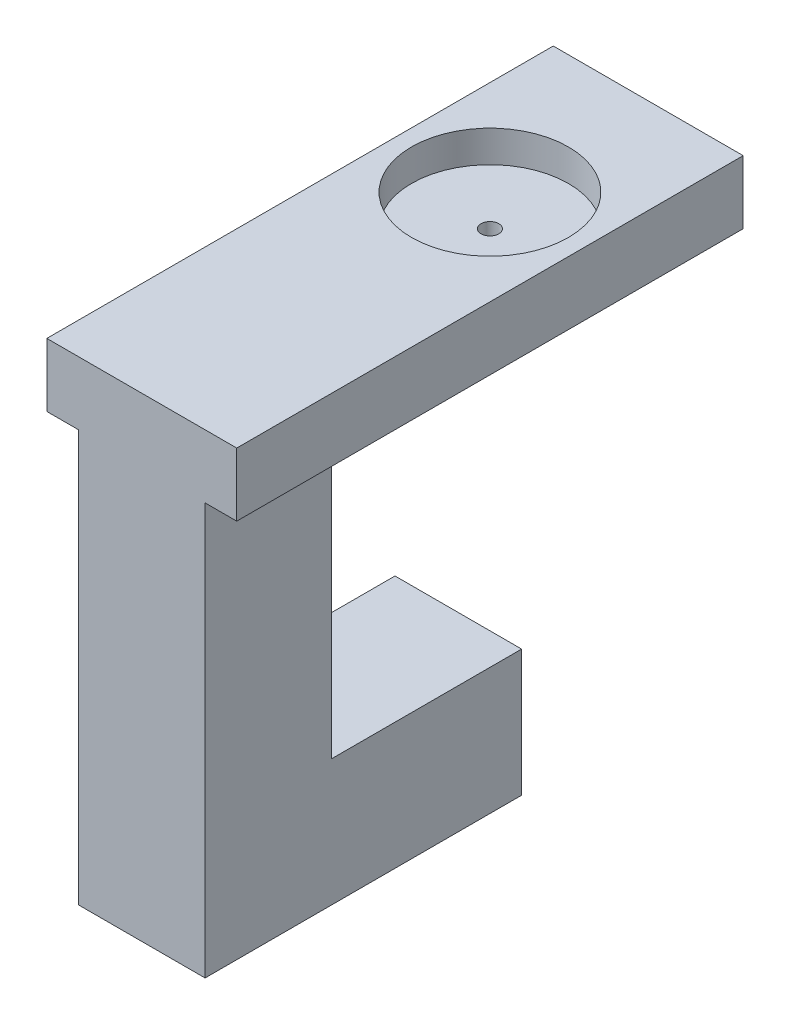
ISO-10303-21;
HEADER;
FILE_DESCRIPTION(('STEP AP214'),'2;1');
FILE_NAME('part.step','',(''),(''),'','','');
FILE_SCHEMA(('AUTOMOTIVE_DESIGN { 1 0 10303 214 1 1 1 1 }'));
ENDSEC;
DATA;
#1=APPLICATION_CONTEXT('core data for automotive mechanical design processes');
#2=APPLICATION_PROTOCOL_DEFINITION('international standard','automotive_design',2000,#1);
#3=PRODUCT_CONTEXT('',#1,'mechanical');
#4=PRODUCT('Part','Part','',(#3));
#5=PRODUCT_RELATED_PRODUCT_CATEGORY('part','',(#4));
#6=PRODUCT_DEFINITION_FORMATION('','',#4);
#7=PRODUCT_DEFINITION_CONTEXT('part definition',#1,'design');
#8=PRODUCT_DEFINITION('design','',#6,#7);
#9=PRODUCT_DEFINITION_SHAPE('','',#8);
#10=(LENGTH_UNIT() NAMED_UNIT(*) SI_UNIT(.MILLI.,.METRE.));
#11=(NAMED_UNIT(*) PLANE_ANGLE_UNIT() SI_UNIT($,.RADIAN.));
#12=(NAMED_UNIT(*) SI_UNIT($,.STERADIAN.) SOLID_ANGLE_UNIT());
#13=UNCERTAINTY_MEASURE_WITH_UNIT(LENGTH_MEASURE(1.E-05),#10,'distance_accuracy_value','');
#14=(GEOMETRIC_REPRESENTATION_CONTEXT(3) GLOBAL_UNCERTAINTY_ASSIGNED_CONTEXT((#13)) GLOBAL_UNIT_ASSIGNED_CONTEXT((#10,
#11,#12)) REPRESENTATION_CONTEXT('',''));
#15=CARTESIAN_POINT('',(0.,0.,0.));
#16=DIRECTION('',(0.,0.,1.));
#17=DIRECTION('',(1.,0.,0.));
#18=AXIS2_PLACEMENT_3D('',#15,#16,#17);
#19=CARTESIAN_POINT('',(0.,5.,-4.99999999999999));
#20=DIRECTION('',(0.,1.,0.));
#21=DIRECTION('',(0.,0.,1.));
#22=AXIS2_PLACEMENT_3D('',#19,#20,#21);
#23=CYLINDRICAL_SURFACE('',#22,1.4);
#24=CARTESIAN_POINT('',(0.,55.,-4.99999999999999));
#25=DIRECTION('',(0.,-1.,0.));
#26=DIRECTION('',(0.,0.,-1.));
#27=AXIS2_PLACEMENT_3D('',#24,#25,#26);
#28=CIRCLE('',#27,1.4);
#29=CARTESIAN_POINT('',(0.,55.,-6.39999999999999));
#30=VERTEX_POINT('',#29);
#31=EDGE_CURVE('E154',#30,#30,#28,.T.);
#32=ORIENTED_EDGE('',*,*,#31,.T.);
#33=EDGE_LOOP('',(#32));
#34=FACE_BOUND('',#33,.T.);
#35=CARTESIAN_POINT('',(0.,60.,-4.99999999999999));
#36=DIRECTION('',(0.,1.,0.));
#37=DIRECTION('',(0.,0.,1.));
#38=AXIS2_PLACEMENT_3D('',#35,#36,#37);
#39=CIRCLE('',#38,1.4);
#40=CARTESIAN_POINT('',(0.,60.,-3.59999999999999));
#41=VERTEX_POINT('',#40);
#42=EDGE_CURVE('E49',#41,#41,#39,.F.);
#43=ORIENTED_EDGE('',*,*,#42,.F.);
#44=EDGE_LOOP('',(#43));
#45=FACE_BOUND('',#44,.T.);
#46=ADVANCED_FACE('F45',(#34,#45),#23,.F.);
#47=CARTESIAN_POINT('',(-10.,10.,50.));
#48=DIRECTION('',(0.,-1.,0.));
#49=DIRECTION('',(0.,0.,-1.));
#50=AXIS2_PLACEMENT_3D('',#47,#48,#49);
#51=PLANE('',#50);
#52=DIRECTION('',(-1.,0.,0.));
#53=VECTOR('',#52,1.);
#54=CARTESIAN_POINT('',(-10.,10.,30.));
#55=LINE('',#54,#53);
#56=CARTESIAN_POINT('',(10.,10.,30.));
#57=VERTEX_POINT('',#56);
#58=CARTESIAN_POINT('',(-10.,10.,30.));
#59=VERTEX_POINT('',#58);
#60=EDGE_CURVE('E191',#57,#59,#55,.T.);
#61=ORIENTED_EDGE('',*,*,#60,.F.);
#62=DIRECTION('',(0.,0.,-1.));
#63=VECTOR('',#62,1.);
#64=CARTESIAN_POINT('',(10.,10.,50.));
#65=LINE('',#64,#63);
#66=CARTESIAN_POINT('',(10.,10.,0.));
#67=VERTEX_POINT('',#66);
#68=EDGE_CURVE('E55',#57,#67,#65,.T.);
#69=ORIENTED_EDGE('',*,*,#68,.T.);
#70=DIRECTION('',(-1.,0.,0.));
#71=VECTOR('',#70,1.);
#72=CARTESIAN_POINT('',(-10.,10.,0.));
#73=LINE('',#72,#71);
#74=CARTESIAN_POINT('',(-10.,10.,0.));
#75=VERTEX_POINT('',#74);
#76=EDGE_CURVE('E215',#67,#75,#73,.T.);
#77=ORIENTED_EDGE('',*,*,#76,.T.);
#78=DIRECTION('',(0.,0.,-1.));
#79=VECTOR('',#78,1.);
#80=CARTESIAN_POINT('',(-10.,10.,50.));
#81=LINE('',#80,#79);
#82=EDGE_CURVE('E231',#59,#75,#81,.T.);
#83=ORIENTED_EDGE('',*,*,#82,.F.);
#84=EDGE_LOOP('',(#61,#69,#77,#83));
#85=FACE_BOUND('',#84,.T.);
#86=ADVANCED_FACE('F239',(#85),#51,.F.);
#87=CARTESIAN_POINT('',(10.,10.,50.));
#88=DIRECTION('',(-1.,0.,0.));
#89=DIRECTION('',(0.,-1.,0.));
#90=AXIS2_PLACEMENT_3D('',#87,#88,#89);
#91=PLANE('',#90);
#92=DIRECTION('',(0.,-1.,0.));
#93=VECTOR('',#92,1.);
#94=CARTESIAN_POINT('',(10.,61.,30.));
#95=LINE('',#94,#93);
#96=CARTESIAN_POINT('',(10.,55.,30.));
#97=VERTEX_POINT('',#96);
#98=EDGE_CURVE('E198',#97,#57,#95,.T.);
#99=ORIENTED_EDGE('',*,*,#98,.F.);
#100=DIRECTION('',(0.,0.,1.));
#101=VECTOR('',#100,1.);
#102=CARTESIAN_POINT('',(9.99999999999999,55.,50.));
#103=LINE('',#102,#101);
#104=CARTESIAN_POINT('',(9.99999999999999,55.,50.));
#105=VERTEX_POINT('',#104);
#106=EDGE_CURVE('E70',#97,#105,#103,.T.);
#107=ORIENTED_EDGE('',*,*,#106,.T.);
#108=DIRECTION('',(0.,1.,0.));
#109=VECTOR('',#108,1.);
#110=CARTESIAN_POINT('',(10.,10.,50.));
#111=LINE('',#110,#109);
#112=CARTESIAN_POINT('',(10.,-10.,50.));
#113=VERTEX_POINT('',#112);
#114=EDGE_CURVE('E202',#113,#105,#111,.T.);
#115=ORIENTED_EDGE('',*,*,#114,.F.);
#116=DIRECTION('',(0.,0.,-1.));
#117=VECTOR('',#116,1.);
#118=CARTESIAN_POINT('',(10.,-10.,50.));
#119=LINE('',#118,#117);
#120=CARTESIAN_POINT('',(10.,-10.,0.));
#121=VERTEX_POINT('',#120);
#122=EDGE_CURVE('E211',#113,#121,#119,.T.);
#123=ORIENTED_EDGE('',*,*,#122,.T.);
#124=DIRECTION('',(0.,1.,0.));
#125=VECTOR('',#124,1.);
#126=CARTESIAN_POINT('',(10.,10.,0.));
#127=LINE('',#126,#125);
#128=EDGE_CURVE('E201',#121,#67,#127,.T.);
#129=ORIENTED_EDGE('',*,*,#128,.T.);
#130=ORIENTED_EDGE('',*,*,#68,.F.);
#131=EDGE_LOOP('',(#99,#107,#115,#123,#129,#130));
#132=FACE_BOUND('',#131,.T.);
#133=ADVANCED_FACE('F47',(#132),#91,.F.);
#134=CARTESIAN_POINT('',(-10.,10.,50.));
#135=DIRECTION('',(1.,0.,0.));
#136=DIRECTION('',(0.,1.,0.));
#137=AXIS2_PLACEMENT_3D('',#134,#135,#136);
#138=PLANE('',#137);
#139=DIRECTION('',(0.,-1.,0.));
#140=VECTOR('',#139,1.);
#141=CARTESIAN_POINT('',(-10.,10.,50.));
#142=LINE('',#141,#140);
#143=CARTESIAN_POINT('',(-10.,55.,50.));
#144=VERTEX_POINT('',#143);
#145=CARTESIAN_POINT('',(-10.,-10.,50.));
#146=VERTEX_POINT('',#145);
#147=EDGE_CURVE('E62',#144,#146,#142,.T.);
#148=ORIENTED_EDGE('',*,*,#147,.F.);
#149=DIRECTION('',(0.,0.,-1.));
#150=VECTOR('',#149,1.);
#151=CARTESIAN_POINT('',(-10.,55.,50.));
#152=LINE('',#151,#150);
#153=CARTESIAN_POINT('',(-10.,55.,30.));
#154=VERTEX_POINT('',#153);
#155=EDGE_CURVE('E181',#144,#154,#152,.T.);
#156=ORIENTED_EDGE('',*,*,#155,.T.);
#157=DIRECTION('',(0.,-1.,0.));
#158=VECTOR('',#157,1.);
#159=CARTESIAN_POINT('',(-10.,61.,30.));
#160=LINE('',#159,#158);
#161=EDGE_CURVE('E195',#154,#59,#160,.T.);
#162=ORIENTED_EDGE('',*,*,#161,.T.);
#163=ORIENTED_EDGE('',*,*,#82,.T.);
#164=DIRECTION('',(0.,-1.,0.));
#165=VECTOR('',#164,1.);
#166=CARTESIAN_POINT('',(-10.,10.,0.));
#167=LINE('',#166,#165);
#168=CARTESIAN_POINT('',(-10.,-10.,0.));
#169=VERTEX_POINT('',#168);
#170=EDGE_CURVE('E219',#75,#169,#167,.T.);
#171=ORIENTED_EDGE('',*,*,#170,.T.);
#172=DIRECTION('',(0.,0.,-1.));
#173=VECTOR('',#172,1.);
#174=CARTESIAN_POINT('',(-10.,-10.,50.));
#175=LINE('',#174,#173);
#176=EDGE_CURVE('E227',#146,#169,#175,.T.);
#177=ORIENTED_EDGE('',*,*,#176,.F.);
#178=EDGE_LOOP('',(#148,#156,#162,#163,#171,#177));
#179=FACE_BOUND('',#178,.T.);
#180=ADVANCED_FACE('F250',(#179),#138,.F.);
#181=CARTESIAN_POINT('',(-10.,-10.,50.));
#182=DIRECTION('',(0.,1.,0.));
#183=DIRECTION('',(0.,0.,1.));
#184=AXIS2_PLACEMENT_3D('',#181,#182,#183);
#185=PLANE('',#184);
#186=DIRECTION('',(1.,0.,0.));
#187=VECTOR('',#186,1.);
#188=CARTESIAN_POINT('',(-10.,-10.,0.));
#189=LINE('',#188,#187);
#190=EDGE_CURVE('E205',#169,#121,#189,.T.);
#191=ORIENTED_EDGE('',*,*,#190,.T.);
#192=ORIENTED_EDGE('',*,*,#122,.F.);
#193=DIRECTION('',(1.,0.,0.));
#194=VECTOR('',#193,1.);
#195=CARTESIAN_POINT('',(-10.,-10.,50.));
#196=LINE('',#195,#194);
#197=EDGE_CURVE('E208',#146,#113,#196,.T.);
#198=ORIENTED_EDGE('',*,*,#197,.F.);
#199=ORIENTED_EDGE('',*,*,#176,.T.);
#200=EDGE_LOOP('',(#191,#192,#198,#199));
#201=FACE_BOUND('',#200,.T.);
#202=ADVANCED_FACE('F249',(#201),#185,.F.);
#203=CARTESIAN_POINT('',(0.,0.,50.));
#204=DIRECTION('',(0.,0.,1.));
#205=DIRECTION('',(1.,0.,0.));
#206=AXIS2_PLACEMENT_3D('',#203,#204,#205);
#207=PLANE('',#206);
#208=ORIENTED_EDGE('',*,*,#114,.T.);
#209=DIRECTION('',(-1.,0.,0.));
#210=VECTOR('',#209,1.);
#211=CARTESIAN_POINT('',(15.,55.,50.));
#212=LINE('',#211,#210);
#213=CARTESIAN_POINT('',(15.,55.,50.));
#214=VERTEX_POINT('',#213);
#215=EDGE_CURVE('E138',#214,#105,#212,.T.);
#216=ORIENTED_EDGE('',*,*,#215,.F.);
#217=DIRECTION('',(0.,-1.,0.));
#218=VECTOR('',#217,1.);
#219=CARTESIAN_POINT('',(15.,65.,50.));
#220=LINE('',#219,#218);
#221=CARTESIAN_POINT('',(15.,65.,50.));
#222=VERTEX_POINT('',#221);
#223=EDGE_CURVE('E170',#222,#214,#220,.T.);
#224=ORIENTED_EDGE('',*,*,#223,.F.);
#225=DIRECTION('',(1.,0.,0.));
#226=VECTOR('',#225,1.);
#227=CARTESIAN_POINT('',(15.,65.,50.));
#228=LINE('',#227,#226);
#229=CARTESIAN_POINT('',(-15.,65.,50.));
#230=VERTEX_POINT('',#229);
#231=EDGE_CURVE('E167',#230,#222,#228,.T.);
#232=ORIENTED_EDGE('',*,*,#231,.F.);
#233=DIRECTION('',(0.,1.,0.));
#234=VECTOR('',#233,1.);
#235=CARTESIAN_POINT('',(-15.,65.,50.));
#236=LINE('',#235,#234);
#237=CARTESIAN_POINT('',(-15.,55.,50.));
#238=VERTEX_POINT('',#237);
#239=EDGE_CURVE('E132',#238,#230,#236,.T.);
#240=ORIENTED_EDGE('',*,*,#239,.F.);
#241=EDGE_CURVE('E174',#144,#238,#212,.T.);
#242=ORIENTED_EDGE('',*,*,#241,.F.);
#243=ORIENTED_EDGE('',*,*,#147,.T.);
#244=ORIENTED_EDGE('',*,*,#197,.T.);
#245=EDGE_LOOP('',(#208,#216,#224,#232,#240,#242,#243,#244));
#246=FACE_BOUND('',#245,.T.);
#247=ADVANCED_FACE('F260',(#246),#207,.T.);
#248=CARTESIAN_POINT('',(0.,0.,0.));
#249=DIRECTION('',(0.,0.,1.));
#250=DIRECTION('',(1.,0.,0.));
#251=AXIS2_PLACEMENT_3D('',#248,#249,#250);
#252=PLANE('',#251);
#253=ORIENTED_EDGE('',*,*,#128,.F.);
#254=ORIENTED_EDGE('',*,*,#190,.F.);
#255=ORIENTED_EDGE('',*,*,#170,.F.);
#256=ORIENTED_EDGE('',*,*,#76,.F.);
#257=EDGE_LOOP('',(#253,#254,#255,#256));
#258=FACE_BOUND('',#257,.T.);
#259=ADVANCED_FACE('F244',(#258),#252,.F.);
#260=CARTESIAN_POINT('',(-10.,61.,30.));
#261=DIRECTION('',(0.,0.,1.));
#262=DIRECTION('',(1.,0.,0.));
#263=AXIS2_PLACEMENT_3D('',#260,#261,#262);
#264=PLANE('',#263);
#265=ORIENTED_EDGE('',*,*,#161,.F.);
#266=DIRECTION('',(1.,0.,0.));
#267=VECTOR('',#266,1.);
#268=CARTESIAN_POINT('',(-10.,55.,30.));
#269=LINE('',#268,#267);
#270=EDGE_CURVE('E11',#154,#97,#269,.T.);
#271=ORIENTED_EDGE('',*,*,#270,.T.);
#272=ORIENTED_EDGE('',*,*,#98,.T.);
#273=ORIENTED_EDGE('',*,*,#60,.T.);
#274=EDGE_LOOP('',(#265,#271,#272,#273));
#275=FACE_BOUND('',#274,.T.);
#276=ADVANCED_FACE('F253',(#275),#264,.F.);
#277=CARTESIAN_POINT('',(15.,55.,50.));
#278=DIRECTION('',(0.,-1.,0.));
#279=DIRECTION('',(0.,0.,-1.));
#280=AXIS2_PLACEMENT_3D('',#277,#278,#279);
#281=PLANE('',#280);
#282=ORIENTED_EDGE('',*,*,#31,.F.);
#283=EDGE_LOOP('',(#282));
#284=FACE_BOUND('',#283,.T.);
#285=ORIENTED_EDGE('',*,*,#106,.F.);
#286=ORIENTED_EDGE('',*,*,#270,.F.);
#287=ORIENTED_EDGE('',*,*,#155,.F.);
#288=ORIENTED_EDGE('',*,*,#241,.T.);
#289=DIRECTION('',(0.,0.,-1.));
#290=VECTOR('',#289,1.);
#291=CARTESIAN_POINT('',(-15.,55.,50.));
#292=LINE('',#291,#290);
#293=CARTESIAN_POINT('',(-15.,55.,-30.));
#294=VERTEX_POINT('',#293);
#295=EDGE_CURVE('E178',#238,#294,#292,.T.);
#296=ORIENTED_EDGE('',*,*,#295,.T.);
#297=DIRECTION('',(-1.,0.,0.));
#298=VECTOR('',#297,1.);
#299=CARTESIAN_POINT('',(15.,55.,-30.));
#300=LINE('',#299,#298);
#301=CARTESIAN_POINT('',(15.,55.,-30.));
#302=VERTEX_POINT('',#301);
#303=EDGE_CURVE('E152',#302,#294,#300,.T.);
#304=ORIENTED_EDGE('',*,*,#303,.F.);
#305=DIRECTION('',(0.,0.,-1.));
#306=VECTOR('',#305,1.);
#307=CARTESIAN_POINT('',(15.,55.,50.));
#308=LINE('',#307,#306);
#309=EDGE_CURVE('E182',#214,#302,#308,.T.);
#310=ORIENTED_EDGE('',*,*,#309,.F.);
#311=ORIENTED_EDGE('',*,*,#215,.T.);
#312=EDGE_LOOP('',(#285,#286,#287,#288,#296,#304,#310,#311));
#313=FACE_BOUND('',#312,.T.);
#314=ADVANCED_FACE('F256',(#284,#313),#281,.T.);
#315=CARTESIAN_POINT('',(-15.,65.,50.));
#316=DIRECTION('',(-1.,0.,0.));
#317=DIRECTION('',(0.,-1.,0.));
#318=AXIS2_PLACEMENT_3D('',#315,#316,#317);
#319=PLANE('',#318);
#320=DIRECTION('',(0.,0.,-1.));
#321=VECTOR('',#320,1.);
#322=CARTESIAN_POINT('',(-15.,65.,50.));
#323=LINE('',#322,#321);
#324=CARTESIAN_POINT('',(-15.,65.,-30.));
#325=VERTEX_POINT('',#324);
#326=EDGE_CURVE('E125',#230,#325,#323,.T.);
#327=ORIENTED_EDGE('',*,*,#326,.T.);
#328=DIRECTION('',(0.,1.,0.));
#329=VECTOR('',#328,1.);
#330=CARTESIAN_POINT('',(-15.,65.,-30.));
#331=LINE('',#330,#329);
#332=EDGE_CURVE('E130',#294,#325,#331,.T.);
#333=ORIENTED_EDGE('',*,*,#332,.F.);
#334=ORIENTED_EDGE('',*,*,#295,.F.);
#335=ORIENTED_EDGE('',*,*,#239,.T.);
#336=EDGE_LOOP('',(#327,#333,#334,#335));
#337=FACE_BOUND('',#336,.T.);
#338=ADVANCED_FACE('F127',(#337),#319,.T.);
#339=CARTESIAN_POINT('',(15.,65.,50.));
#340=DIRECTION('',(1.,0.,0.));
#341=DIRECTION('',(0.,1.,0.));
#342=AXIS2_PLACEMENT_3D('',#339,#340,#341);
#343=PLANE('',#342);
#344=ORIENTED_EDGE('',*,*,#309,.T.);
#345=DIRECTION('',(0.,-1.,0.));
#346=VECTOR('',#345,1.);
#347=CARTESIAN_POINT('',(15.,65.,-30.));
#348=LINE('',#347,#346);
#349=CARTESIAN_POINT('',(15.,65.,-30.));
#350=VERTEX_POINT('',#349);
#351=EDGE_CURVE('E147',#350,#302,#348,.T.);
#352=ORIENTED_EDGE('',*,*,#351,.F.);
#353=DIRECTION('',(0.,0.,-1.));
#354=VECTOR('',#353,1.);
#355=CARTESIAN_POINT('',(15.,65.,50.));
#356=LINE('',#355,#354);
#357=EDGE_CURVE('E137',#222,#350,#356,.T.);
#358=ORIENTED_EDGE('',*,*,#357,.F.);
#359=ORIENTED_EDGE('',*,*,#223,.T.);
#360=EDGE_LOOP('',(#344,#352,#358,#359));
#361=FACE_BOUND('',#360,.T.);
#362=ADVANCED_FACE('F264',(#361),#343,.T.);
#363=CARTESIAN_POINT('',(15.,65.,50.));
#364=DIRECTION('',(0.,1.,0.));
#365=DIRECTION('',(0.,0.,1.));
#366=AXIS2_PLACEMENT_3D('',#363,#364,#365);
#367=PLANE('',#366);
#368=CARTESIAN_POINT('',(0.,65.,-4.99999999999999));
#369=DIRECTION('',(0.,1.,0.));
#370=DIRECTION('',(0.,0.,1.));
#371=AXIS2_PLACEMENT_3D('',#368,#369,#370);
#372=CIRCLE('',#371,12.395);
#373=CARTESIAN_POINT('',(0.,65.,7.39500000000001));
#374=VERTEX_POINT('',#373);
#375=EDGE_CURVE('E399',#374,#374,#372,.T.);
#376=ORIENTED_EDGE('',*,*,#375,.F.);
#377=EDGE_LOOP('',(#376));
#378=FACE_BOUND('',#377,.T.);
#379=ORIENTED_EDGE('',*,*,#357,.T.);
#380=DIRECTION('',(1.,0.,0.));
#381=VECTOR('',#380,1.);
#382=CARTESIAN_POINT('',(15.,65.,-30.));
#383=LINE('',#382,#381);
#384=EDGE_CURVE('E141',#325,#350,#383,.T.);
#385=ORIENTED_EDGE('',*,*,#384,.F.);
#386=ORIENTED_EDGE('',*,*,#326,.F.);
#387=ORIENTED_EDGE('',*,*,#231,.T.);
#388=EDGE_LOOP('',(#379,#385,#386,#387));
#389=FACE_BOUND('',#388,.T.);
#390=ADVANCED_FACE('F142',(#378,#389),#367,.T.);
#391=CARTESIAN_POINT('',(0.,0.,-30.));
#392=DIRECTION('',(0.,0.,-1.));
#393=DIRECTION('',(-1.,0.,0.));
#394=AXIS2_PLACEMENT_3D('',#391,#392,#393);
#395=PLANE('',#394);
#396=ORIENTED_EDGE('',*,*,#332,.T.);
#397=ORIENTED_EDGE('',*,*,#384,.T.);
#398=ORIENTED_EDGE('',*,*,#351,.T.);
#399=ORIENTED_EDGE('',*,*,#303,.T.);
#400=EDGE_LOOP('',(#396,#397,#398,#399));
#401=FACE_BOUND('',#400,.T.);
#402=ADVANCED_FACE('F150',(#401),#395,.T.);
#403=CARTESIAN_POINT('',(0.,60.,-4.99999999999999));
#404=DIRECTION('',(0.,1.,0.));
#405=DIRECTION('',(0.,0.,1.));
#406=AXIS2_PLACEMENT_3D('',#403,#404,#405);
#407=PLANE('',#406);
#408=CARTESIAN_POINT('',(0.,60.,-4.99999999999999));
#409=DIRECTION('',(0.,1.,0.));
#410=DIRECTION('',(0.,0.,1.));
#411=AXIS2_PLACEMENT_3D('',#408,#409,#410);
#412=CIRCLE('',#411,12.395);
#413=CARTESIAN_POINT('',(0.,60.,7.39500000000001));
#414=VERTEX_POINT('',#413);
#415=EDGE_CURVE('E396',#414,#414,#412,.T.);
#416=ORIENTED_EDGE('',*,*,#415,.T.);
#417=EDGE_LOOP('',(#416));
#418=FACE_BOUND('',#417,.T.);
#419=ORIENTED_EDGE('',*,*,#42,.T.);
#420=EDGE_LOOP('',(#419));
#421=FACE_BOUND('',#420,.T.);
#422=ADVANCED_FACE('F288',(#418,#421),#407,.T.);
#423=CARTESIAN_POINT('',(0.,60.,-4.99999999999999));
#424=DIRECTION('',(0.,1.,0.));
#425=DIRECTION('',(0.,0.,1.));
#426=AXIS2_PLACEMENT_3D('',#423,#424,#425);
#427=CYLINDRICAL_SURFACE('',#426,12.395);
#428=ORIENTED_EDGE('',*,*,#415,.F.);
#429=EDGE_LOOP('',(#428));
#430=FACE_BOUND('',#429,.T.);
#431=ORIENTED_EDGE('',*,*,#375,.T.);
#432=EDGE_LOOP('',(#431));
#433=FACE_BOUND('',#432,.T.);
#434=ADVANCED_FACE('F286',(#430,#433),#427,.F.);
#435=CLOSED_SHELL('',(#46,#86,#133,#180,#202,#247,#259,#276,#314,#338,#362,#390,#402,#422,#434));
#436=MANIFOLD_SOLID_BREP('B2',#435);
#437=ADVANCED_BREP_SHAPE_REPRESENTATION('',(#18,#436),#14);
#438=SHAPE_DEFINITION_REPRESENTATION(#9,#437);
ENDSEC;
END-ISO-10303-21;
